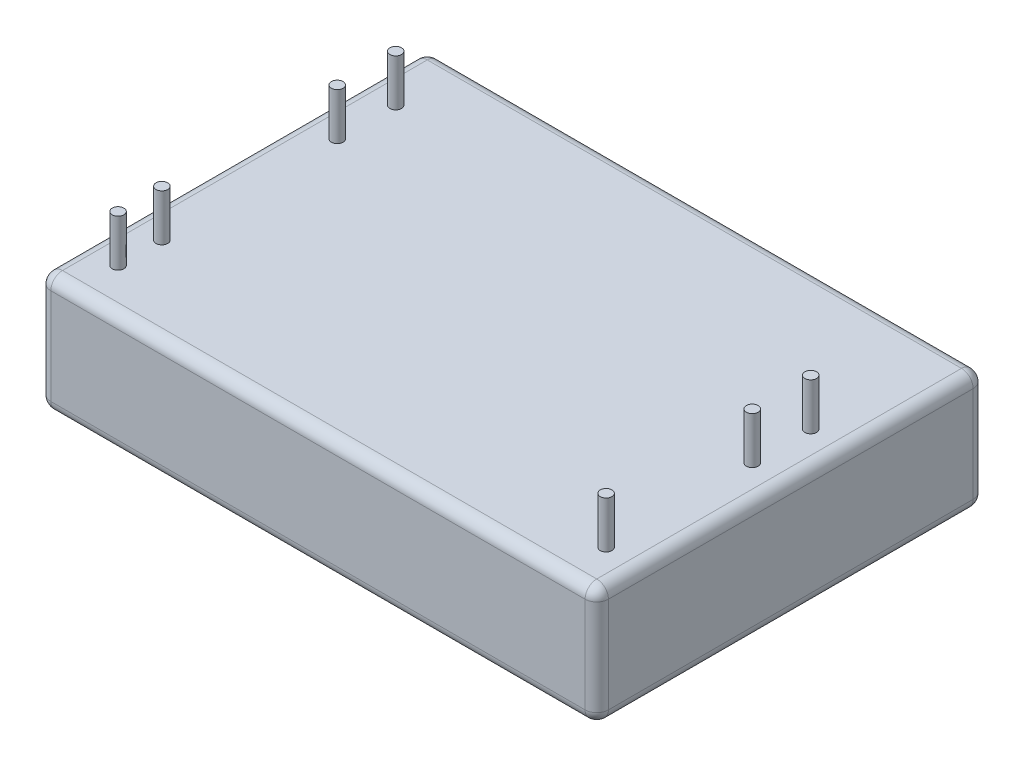
ISO-10303-21;
HEADER;
FILE_DESCRIPTION(('STEP AP214'),'2;1');
FILE_NAME('part.step','',(''),(''),'','','');
FILE_SCHEMA(('AUTOMOTIVE_DESIGN { 1 0 10303 214 1 1 1 1 }'));
ENDSEC;
DATA;
#1=APPLICATION_CONTEXT('core data for automotive mechanical design processes');
#2=APPLICATION_PROTOCOL_DEFINITION('international standard','automotive_design',2000,#1);
#3=PRODUCT_CONTEXT('',#1,'mechanical');
#4=PRODUCT('Part','Part','',(#3));
#5=PRODUCT_RELATED_PRODUCT_CATEGORY('part','',(#4));
#6=PRODUCT_DEFINITION_FORMATION('','',#4);
#7=PRODUCT_DEFINITION_CONTEXT('part definition',#1,'design');
#8=PRODUCT_DEFINITION('design','',#6,#7);
#9=PRODUCT_DEFINITION_SHAPE('','',#8);
#10=(LENGTH_UNIT() NAMED_UNIT(*) SI_UNIT(.MILLI.,.METRE.));
#11=(NAMED_UNIT(*) PLANE_ANGLE_UNIT() SI_UNIT($,.RADIAN.));
#12=(NAMED_UNIT(*) SI_UNIT($,.STERADIAN.) SOLID_ANGLE_UNIT());
#13=UNCERTAINTY_MEASURE_WITH_UNIT(LENGTH_MEASURE(1.E-05),#10,'distance_accuracy_value','');
#14=(GEOMETRIC_REPRESENTATION_CONTEXT(3) GLOBAL_UNCERTAINTY_ASSIGNED_CONTEXT((#13)) GLOBAL_UNIT_ASSIGNED_CONTEXT((#10,
#11,#12)) REPRESENTATION_CONTEXT('',''));
#15=CARTESIAN_POINT('',(0.,0.,0.));
#16=DIRECTION('',(0.,0.,1.));
#17=DIRECTION('',(1.,0.,0.));
#18=AXIS2_PLACEMENT_3D('',#15,#16,#17);
#19=CARTESIAN_POINT('',(23.85,10.2,-16.6));
#20=DIRECTION('',(-1.,0.,0.));
#21=DIRECTION('',(0.,0.,1.));
#22=AXIS2_PLACEMENT_3D('',#19,#20,#21);
#23=PLANE('',#22);
#24=DIRECTION('',(0.,0.,-1.));
#25=VECTOR('',#24,1.);
#26=CARTESIAN_POINT('',(23.85,0.999999999999999,-16.6));
#27=LINE('',#26,#25);
#28=CARTESIAN_POINT('',(23.85,0.999999999999999,15.6));
#29=VERTEX_POINT('',#28);
#30=CARTESIAN_POINT('',(23.85,0.999999999999999,-15.6));
#31=VERTEX_POINT('',#30);
#32=EDGE_CURVE('E293',#29,#31,#27,.T.);
#33=ORIENTED_EDGE('',*,*,#32,.T.);
#34=DIRECTION('',(0.,-1.,0.));
#35=VECTOR('',#34,1.);
#36=CARTESIAN_POINT('',(23.85,10.2,-15.6));
#37=LINE('',#36,#35);
#38=CARTESIAN_POINT('',(23.85,9.2,-15.6));
#39=VERTEX_POINT('',#38);
#40=EDGE_CURVE('E11',#31,#39,#37,.F.);
#41=ORIENTED_EDGE('',*,*,#40,.T.);
#42=DIRECTION('',(0.,0.,-1.));
#43=VECTOR('',#42,1.);
#44=CARTESIAN_POINT('',(23.85,9.2,15.6));
#45=LINE('',#44,#43);
#46=CARTESIAN_POINT('',(23.85,9.2,15.6));
#47=VERTEX_POINT('',#46);
#48=EDGE_CURVE('E141',#39,#47,#45,.F.);
#49=ORIENTED_EDGE('',*,*,#48,.T.);
#50=DIRECTION('',(0.,-1.,0.));
#51=VECTOR('',#50,1.);
#52=CARTESIAN_POINT('',(23.85,10.2,15.6));
#53=LINE('',#52,#51);
#54=EDGE_CURVE('E285',#47,#29,#53,.T.);
#55=ORIENTED_EDGE('',*,*,#54,.T.);
#56=EDGE_LOOP('',(#33,#41,#49,#55));
#57=FACE_BOUND('',#56,.T.);
#58=ADVANCED_FACE('F37',(#57),#23,.F.);
#59=CARTESIAN_POINT('',(-23.85,10.2,-16.6));
#60=DIRECTION('',(0.,0.,1.));
#61=DIRECTION('',(1.,0.,0.));
#62=AXIS2_PLACEMENT_3D('',#59,#60,#61);
#63=PLANE('',#62);
#64=DIRECTION('',(-1.,0.,0.));
#65=VECTOR('',#64,1.);
#66=CARTESIAN_POINT('',(23.85,9.2,-16.6));
#67=LINE('',#66,#65);
#68=CARTESIAN_POINT('',(-22.85,9.2,-16.6));
#69=VERTEX_POINT('',#68);
#70=CARTESIAN_POINT('',(22.85,9.2,-16.6));
#71=VERTEX_POINT('',#70);
#72=EDGE_CURVE('E166',#69,#71,#67,.F.);
#73=ORIENTED_EDGE('',*,*,#72,.T.);
#74=DIRECTION('',(0.,-1.,0.));
#75=VECTOR('',#74,1.);
#76=CARTESIAN_POINT('',(22.85,10.2,-16.6));
#77=LINE('',#76,#75);
#78=CARTESIAN_POINT('',(22.85,0.999999999999999,-16.6));
#79=VERTEX_POINT('',#78);
#80=EDGE_CURVE('E46',#71,#79,#77,.T.);
#81=ORIENTED_EDGE('',*,*,#80,.T.);
#82=DIRECTION('',(-1.,0.,0.));
#83=VECTOR('',#82,1.);
#84=CARTESIAN_POINT('',(-23.85,0.999999999999999,-16.6));
#85=LINE('',#84,#83);
#86=CARTESIAN_POINT('',(-22.85,0.999999999999999,-16.6));
#87=VERTEX_POINT('',#86);
#88=EDGE_CURVE('E228',#79,#87,#85,.T.);
#89=ORIENTED_EDGE('',*,*,#88,.T.);
#90=DIRECTION('',(0.,-1.,0.));
#91=VECTOR('',#90,1.);
#92=CARTESIAN_POINT('',(-22.85,10.2,-16.6));
#93=LINE('',#92,#91);
#94=EDGE_CURVE('E259',#87,#69,#93,.F.);
#95=ORIENTED_EDGE('',*,*,#94,.T.);
#96=EDGE_LOOP('',(#73,#81,#89,#95));
#97=FACE_BOUND('',#96,.T.);
#98=ADVANCED_FACE('F257',(#97),#63,.F.);
#99=CARTESIAN_POINT('',(-23.85,10.2,-16.6));
#100=DIRECTION('',(1.,0.,0.));
#101=DIRECTION('',(0.,0.,-1.));
#102=AXIS2_PLACEMENT_3D('',#99,#100,#101);
#103=PLANE('',#102);
#104=DIRECTION('',(0.,-1.,0.));
#105=VECTOR('',#104,1.);
#106=CARTESIAN_POINT('',(-23.85,10.2,15.6));
#107=LINE('',#106,#105);
#108=CARTESIAN_POINT('',(-23.85,0.999999999999999,15.6));
#109=VERTEX_POINT('',#108);
#110=CARTESIAN_POINT('',(-23.85,9.2,15.6));
#111=VERTEX_POINT('',#110);
#112=EDGE_CURVE('E173',#109,#111,#107,.F.);
#113=ORIENTED_EDGE('',*,*,#112,.T.);
#114=DIRECTION('',(0.,0.,1.));
#115=VECTOR('',#114,1.);
#116=CARTESIAN_POINT('',(-23.85,9.2,-15.6));
#117=LINE('',#116,#115);
#118=CARTESIAN_POINT('',(-23.85,9.2,-15.6));
#119=VERTEX_POINT('',#118);
#120=EDGE_CURVE('E175',#111,#119,#117,.F.);
#121=ORIENTED_EDGE('',*,*,#120,.T.);
#122=DIRECTION('',(0.,-1.,0.));
#123=VECTOR('',#122,1.);
#124=CARTESIAN_POINT('',(-23.85,10.2,-15.6));
#125=LINE('',#124,#123);
#126=CARTESIAN_POINT('',(-23.85,0.999999999999999,-15.6));
#127=VERTEX_POINT('',#126);
#128=EDGE_CURVE('E311',#119,#127,#125,.T.);
#129=ORIENTED_EDGE('',*,*,#128,.T.);
#130=DIRECTION('',(0.,0.,1.));
#131=VECTOR('',#130,1.);
#132=CARTESIAN_POINT('',(-23.85,0.999999999999999,-16.6));
#133=LINE('',#132,#131);
#134=EDGE_CURVE('E152',#127,#109,#133,.T.);
#135=ORIENTED_EDGE('',*,*,#134,.T.);
#136=EDGE_LOOP('',(#113,#121,#129,#135));
#137=FACE_BOUND('',#136,.T.);
#138=ADVANCED_FACE('F309',(#137),#103,.F.);
#139=CARTESIAN_POINT('',(-23.85,10.2,16.6));
#140=DIRECTION('',(0.,0.,-1.));
#141=DIRECTION('',(-1.,0.,0.));
#142=AXIS2_PLACEMENT_3D('',#139,#140,#141);
#143=PLANE('',#142);
#144=DIRECTION('',(1.,0.,0.));
#145=VECTOR('',#144,1.);
#146=CARTESIAN_POINT('',(-23.85,9.2,16.6));
#147=LINE('',#146,#145);
#148=CARTESIAN_POINT('',(22.85,9.2,16.6));
#149=VERTEX_POINT('',#148);
#150=CARTESIAN_POINT('',(-22.85,9.2,16.6));
#151=VERTEX_POINT('',#150);
#152=EDGE_CURVE('E177',#149,#151,#147,.F.);
#153=ORIENTED_EDGE('',*,*,#152,.T.);
#154=DIRECTION('',(0.,-1.,0.));
#155=VECTOR('',#154,1.);
#156=CARTESIAN_POINT('',(-22.85,10.2,16.6));
#157=LINE('',#156,#155);
#158=CARTESIAN_POINT('',(-22.85,0.999999999999999,16.6));
#159=VERTEX_POINT('',#158);
#160=EDGE_CURVE('E179',#151,#159,#157,.T.);
#161=ORIENTED_EDGE('',*,*,#160,.T.);
#162=DIRECTION('',(1.,0.,0.));
#163=VECTOR('',#162,1.);
#164=CARTESIAN_POINT('',(-23.85,0.999999999999999,16.6));
#165=LINE('',#164,#163);
#166=CARTESIAN_POINT('',(22.85,0.999999999999999,16.6));
#167=VERTEX_POINT('',#166);
#168=EDGE_CURVE('E136',#159,#167,#165,.T.);
#169=ORIENTED_EDGE('',*,*,#168,.T.);
#170=DIRECTION('',(0.,-1.,0.));
#171=VECTOR('',#170,1.);
#172=CARTESIAN_POINT('',(22.85,10.2,16.6));
#173=LINE('',#172,#171);
#174=EDGE_CURVE('E292',#167,#149,#173,.F.);
#175=ORIENTED_EDGE('',*,*,#174,.T.);
#176=EDGE_LOOP('',(#153,#161,#169,#175));
#177=FACE_BOUND('',#176,.T.);
#178=ADVANCED_FACE('F304',(#177),#143,.F.);
#179=CARTESIAN_POINT('',(0.,10.2,0.));
#180=DIRECTION('',(0.,1.,0.));
#181=DIRECTION('',(0.,0.,1.));
#182=AXIS2_PLACEMENT_3D('',#179,#180,#181);
#183=PLANE('',#182);
#184=DIRECTION('',(0.,0.,-1.));
#185=VECTOR('',#184,1.);
#186=CARTESIAN_POINT('',(22.85,10.2,-16.6));
#187=LINE('',#186,#185);
#188=CARTESIAN_POINT('',(22.85,10.2,15.6));
#189=VERTEX_POINT('',#188);
#190=CARTESIAN_POINT('',(22.85,10.2,-15.6));
#191=VERTEX_POINT('',#190);
#192=EDGE_CURVE('E250',#189,#191,#187,.T.);
#193=ORIENTED_EDGE('',*,*,#192,.T.);
#194=DIRECTION('',(-1.,0.,0.));
#195=VECTOR('',#194,1.);
#196=CARTESIAN_POINT('',(-22.85,10.2,-15.6));
#197=LINE('',#196,#195);
#198=CARTESIAN_POINT('',(-22.85,10.2,-15.6));
#199=VERTEX_POINT('',#198);
#200=EDGE_CURVE('E253',#191,#199,#197,.T.);
#201=ORIENTED_EDGE('',*,*,#200,.T.);
#202=DIRECTION('',(0.,0.,1.));
#203=VECTOR('',#202,1.);
#204=CARTESIAN_POINT('',(-22.85,10.2,16.6));
#205=LINE('',#204,#203);
#206=CARTESIAN_POINT('',(-22.85,10.2,15.6));
#207=VERTEX_POINT('',#206);
#208=EDGE_CURVE('E236',#199,#207,#205,.T.);
#209=ORIENTED_EDGE('',*,*,#208,.T.);
#210=DIRECTION('',(1.,0.,0.));
#211=VECTOR('',#210,1.);
#212=CARTESIAN_POINT('',(22.85,10.2,15.6));
#213=LINE('',#212,#211);
#214=EDGE_CURVE('E234',#207,#189,#213,.T.);
#215=ORIENTED_EDGE('',*,*,#214,.T.);
#216=EDGE_LOOP('',(#193,#201,#209,#215));
#217=FACE_BOUND('',#216,.T.);
#218=CARTESIAN_POINT('',(20.9,10.2,-4.65));
#219=DIRECTION('',(0.,1.,0.));
#220=DIRECTION('',(0.,0.,1.));
#221=AXIS2_PLACEMENT_3D('',#218,#219,#220);
#222=CIRCLE('',#221,0.499999999999999);
#223=CARTESIAN_POINT('',(20.9,10.2,-4.15000000000001));
#224=VERTEX_POINT('',#223);
#225=EDGE_CURVE('E247',#224,#224,#222,.T.);
#226=ORIENTED_EDGE('',*,*,#225,.F.);
#227=EDGE_LOOP('',(#226));
#228=FACE_BOUND('',#227,.T.);
#229=CARTESIAN_POINT('',(-20.85,10.2,9.1));
#230=DIRECTION('',(0.,1.,0.));
#231=DIRECTION('',(0.,0.,1.));
#232=AXIS2_PLACEMENT_3D('',#229,#230,#231);
#233=CIRCLE('',#232,0.499999999999999);
#234=CARTESIAN_POINT('',(-20.85,10.2,9.6));
#235=VERTEX_POINT('',#234);
#236=EDGE_CURVE('E727',#235,#235,#233,.T.);
#237=ORIENTED_EDGE('',*,*,#236,.F.);
#238=EDGE_LOOP('',(#237));
#239=FACE_BOUND('',#238,.T.);
#240=CARTESIAN_POINT('',(-20.85,10.2,12.85));
#241=DIRECTION('',(0.,1.,0.));
#242=DIRECTION('',(0.,0.,1.));
#243=AXIS2_PLACEMENT_3D('',#240,#241,#242);
#244=CIRCLE('',#243,0.499999999999999);
#245=CARTESIAN_POINT('',(-20.85,10.2,13.35));
#246=VERTEX_POINT('',#245);
#247=EDGE_CURVE('E721',#246,#246,#244,.T.);
#248=ORIENTED_EDGE('',*,*,#247,.F.);
#249=EDGE_LOOP('',(#248));
#250=FACE_BOUND('',#249,.T.);
#251=CARTESIAN_POINT('',(20.9,10.2,0.349999999999996));
#252=DIRECTION('',(0.,1.,0.));
#253=DIRECTION('',(0.,0.,1.));
#254=AXIS2_PLACEMENT_3D('',#251,#252,#253);
#255=CIRCLE('',#254,0.499999999999999);
#256=CARTESIAN_POINT('',(20.9,10.2,0.849999999999995));
#257=VERTEX_POINT('',#256);
#258=EDGE_CURVE('E715',#257,#257,#255,.T.);
#259=ORIENTED_EDGE('',*,*,#258,.F.);
#260=EDGE_LOOP('',(#259));
#261=FACE_BOUND('',#260,.T.);
#262=CARTESIAN_POINT('',(20.9,10.2,12.85));
#263=DIRECTION('',(0.,1.,0.));
#264=DIRECTION('',(0.,0.,1.));
#265=AXIS2_PLACEMENT_3D('',#262,#263,#264);
#266=CIRCLE('',#265,0.499999999999999);
#267=CARTESIAN_POINT('',(20.9,10.2,13.35));
#268=VERTEX_POINT('',#267);
#269=EDGE_CURVE('E709',#268,#268,#266,.T.);
#270=ORIENTED_EDGE('',*,*,#269,.F.);
#271=EDGE_LOOP('',(#270));
#272=FACE_BOUND('',#271,.T.);
#273=CARTESIAN_POINT('',(-20.85,10.2,-10.9));
#274=DIRECTION('',(0.,1.,0.));
#275=DIRECTION('',(0.,0.,1.));
#276=AXIS2_PLACEMENT_3D('',#273,#274,#275);
#277=CIRCLE('',#276,0.499999999999999);
#278=CARTESIAN_POINT('',(-20.85,10.2,-10.4));
#279=VERTEX_POINT('',#278);
#280=EDGE_CURVE('E702',#279,#279,#277,.T.);
#281=ORIENTED_EDGE('',*,*,#280,.F.);
#282=EDGE_LOOP('',(#281));
#283=FACE_BOUND('',#282,.T.);
#284=CARTESIAN_POINT('',(-20.85,10.2,-5.9));
#285=DIRECTION('',(0.,1.,0.));
#286=DIRECTION('',(0.,0.,1.));
#287=AXIS2_PLACEMENT_3D('',#284,#285,#286);
#288=CIRCLE('',#287,0.499999999999999);
#289=CARTESIAN_POINT('',(-20.85,10.2,-5.4));
#290=VERTEX_POINT('',#289);
#291=EDGE_CURVE('E316',#290,#290,#288,.T.);
#292=ORIENTED_EDGE('',*,*,#291,.F.);
#293=EDGE_LOOP('',(#292));
#294=FACE_BOUND('',#293,.T.);
#295=ADVANCED_FACE('F275',(#217,#228,#239,#250,#261,#272,#283,#294),#183,.T.);
#296=CARTESIAN_POINT('',(0.,0.,0.));
#297=DIRECTION('',(0.,1.,0.));
#298=DIRECTION('',(0.,0.,1.));
#299=AXIS2_PLACEMENT_3D('',#296,#297,#298);
#300=PLANE('',#299);
#301=DIRECTION('',(-1.,0.,0.));
#302=VECTOR('',#301,1.);
#303=CARTESIAN_POINT('',(0.,0.,-15.6));
#304=LINE('',#303,#302);
#305=CARTESIAN_POINT('',(-22.85,0.,-15.6));
#306=VERTEX_POINT('',#305);
#307=CARTESIAN_POINT('',(22.85,0.,-15.6));
#308=VERTEX_POINT('',#307);
#309=EDGE_CURVE('E227',#306,#308,#304,.F.);
#310=ORIENTED_EDGE('',*,*,#309,.T.);
#311=DIRECTION('',(0.,0.,-1.));
#312=VECTOR('',#311,1.);
#313=CARTESIAN_POINT('',(22.85,0.,0.));
#314=LINE('',#313,#312);
#315=CARTESIAN_POINT('',(22.85,0.,15.6));
#316=VERTEX_POINT('',#315);
#317=EDGE_CURVE('E151',#308,#316,#314,.F.);
#318=ORIENTED_EDGE('',*,*,#317,.T.);
#319=DIRECTION('',(1.,0.,0.));
#320=VECTOR('',#319,1.);
#321=CARTESIAN_POINT('',(0.,0.,15.6));
#322=LINE('',#321,#320);
#323=CARTESIAN_POINT('',(-22.85,0.,15.6));
#324=VERTEX_POINT('',#323);
#325=EDGE_CURVE('E134',#316,#324,#322,.F.);
#326=ORIENTED_EDGE('',*,*,#325,.T.);
#327=DIRECTION('',(0.,0.,1.));
#328=VECTOR('',#327,1.);
#329=CARTESIAN_POINT('',(-22.85,0.,0.));
#330=LINE('',#329,#328);
#331=EDGE_CURVE('E149',#324,#306,#330,.F.);
#332=ORIENTED_EDGE('',*,*,#331,.T.);
#333=EDGE_LOOP('',(#310,#318,#326,#332));
#334=FACE_BOUND('',#333,.T.);
#335=ADVANCED_FACE('F148',(#334),#300,.F.);
#336=CARTESIAN_POINT('',(-20.85,14.2,-5.9));
#337=DIRECTION('',(0.,-1.,0.));
#338=DIRECTION('',(0.,0.,-1.));
#339=AXIS2_PLACEMENT_3D('',#336,#337,#338);
#340=CYLINDRICAL_SURFACE('',#339,0.499999999999999);
#341=CARTESIAN_POINT('',(-20.85,14.2,-5.9));
#342=DIRECTION('',(0.,1.,0.));
#343=DIRECTION('',(0.,0.,1.));
#344=AXIS2_PLACEMENT_3D('',#341,#342,#343);
#345=CIRCLE('',#344,0.499999999999999);
#346=CARTESIAN_POINT('',(-20.85,14.2,-5.4));
#347=VERTEX_POINT('',#346);
#348=EDGE_CURVE('E313',#347,#347,#345,.T.);
#349=ORIENTED_EDGE('',*,*,#348,.F.);
#350=EDGE_LOOP('',(#349));
#351=FACE_BOUND('',#350,.T.);
#352=ORIENTED_EDGE('',*,*,#291,.T.);
#353=EDGE_LOOP('',(#352));
#354=FACE_BOUND('',#353,.T.);
#355=ADVANCED_FACE('F629',(#351,#354),#340,.T.);
#356=CARTESIAN_POINT('',(-20.85,14.2,-5.9));
#357=DIRECTION('',(0.,1.,0.));
#358=DIRECTION('',(0.,0.,1.));
#359=AXIS2_PLACEMENT_3D('',#356,#357,#358);
#360=PLANE('',#359);
#361=ORIENTED_EDGE('',*,*,#348,.T.);
#362=EDGE_LOOP('',(#361));
#363=FACE_BOUND('',#362,.T.);
#364=ADVANCED_FACE('F620',(#363),#360,.T.);
#365=CARTESIAN_POINT('',(-20.85,14.2,-10.9));
#366=DIRECTION('',(0.,-1.,0.));
#367=DIRECTION('',(0.,0.,-1.));
#368=AXIS2_PLACEMENT_3D('',#365,#366,#367);
#369=CYLINDRICAL_SURFACE('',#368,0.499999999999999);
#370=CARTESIAN_POINT('',(-20.85,14.2,-10.9));
#371=DIRECTION('',(0.,1.,0.));
#372=DIRECTION('',(0.,0.,1.));
#373=AXIS2_PLACEMENT_3D('',#370,#371,#372);
#374=CIRCLE('',#373,0.499999999999999);
#375=CARTESIAN_POINT('',(-20.85,14.2,-10.4));
#376=VERTEX_POINT('',#375);
#377=EDGE_CURVE('E700',#376,#376,#374,.T.);
#378=ORIENTED_EDGE('',*,*,#377,.F.);
#379=EDGE_LOOP('',(#378));
#380=FACE_BOUND('',#379,.T.);
#381=ORIENTED_EDGE('',*,*,#280,.T.);
#382=EDGE_LOOP('',(#381));
#383=FACE_BOUND('',#382,.T.);
#384=ADVANCED_FACE('F611',(#380,#383),#369,.T.);
#385=CARTESIAN_POINT('',(-20.85,14.2,-10.9));
#386=DIRECTION('',(0.,1.,0.));
#387=DIRECTION('',(0.,0.,1.));
#388=AXIS2_PLACEMENT_3D('',#385,#386,#387);
#389=PLANE('',#388);
#390=ORIENTED_EDGE('',*,*,#377,.T.);
#391=EDGE_LOOP('',(#390));
#392=FACE_BOUND('',#391,.T.);
#393=ADVANCED_FACE('F602',(#392),#389,.T.);
#394=CARTESIAN_POINT('',(20.9,14.2,12.85));
#395=DIRECTION('',(0.,-1.,0.));
#396=DIRECTION('',(0.,0.,-1.));
#397=AXIS2_PLACEMENT_3D('',#394,#395,#396);
#398=CYLINDRICAL_SURFACE('',#397,0.499999999999999);
#399=CARTESIAN_POINT('',(20.9,14.2,12.85));
#400=DIRECTION('',(0.,1.,0.));
#401=DIRECTION('',(0.,0.,1.));
#402=AXIS2_PLACEMENT_3D('',#399,#400,#401);
#403=CIRCLE('',#402,0.499999999999999);
#404=CARTESIAN_POINT('',(20.9,14.2,13.35));
#405=VERTEX_POINT('',#404);
#406=EDGE_CURVE('E706',#405,#405,#403,.T.);
#407=ORIENTED_EDGE('',*,*,#406,.F.);
#408=EDGE_LOOP('',(#407));
#409=FACE_BOUND('',#408,.T.);
#410=ORIENTED_EDGE('',*,*,#269,.T.);
#411=EDGE_LOOP('',(#410));
#412=FACE_BOUND('',#411,.T.);
#413=ADVANCED_FACE('F593',(#409,#412),#398,.T.);
#414=CARTESIAN_POINT('',(20.9,14.2,12.85));
#415=DIRECTION('',(0.,1.,0.));
#416=DIRECTION('',(0.,0.,1.));
#417=AXIS2_PLACEMENT_3D('',#414,#415,#416);
#418=PLANE('',#417);
#419=ORIENTED_EDGE('',*,*,#406,.T.);
#420=EDGE_LOOP('',(#419));
#421=FACE_BOUND('',#420,.T.);
#422=ADVANCED_FACE('F584',(#421),#418,.T.);
#423=CARTESIAN_POINT('',(20.9,14.2,0.349999999999996));
#424=DIRECTION('',(0.,-1.,0.));
#425=DIRECTION('',(0.,0.,-1.));
#426=AXIS2_PLACEMENT_3D('',#423,#424,#425);
#427=CYLINDRICAL_SURFACE('',#426,0.499999999999999);
#428=CARTESIAN_POINT('',(20.9,14.2,0.349999999999996));
#429=DIRECTION('',(0.,1.,0.));
#430=DIRECTION('',(0.,0.,1.));
#431=AXIS2_PLACEMENT_3D('',#428,#429,#430);
#432=CIRCLE('',#431,0.499999999999999);
#433=CARTESIAN_POINT('',(20.9,14.2,0.849999999999995));
#434=VERTEX_POINT('',#433);
#435=EDGE_CURVE('E712',#434,#434,#432,.T.);
#436=ORIENTED_EDGE('',*,*,#435,.F.);
#437=EDGE_LOOP('',(#436));
#438=FACE_BOUND('',#437,.T.);
#439=ORIENTED_EDGE('',*,*,#258,.T.);
#440=EDGE_LOOP('',(#439));
#441=FACE_BOUND('',#440,.T.);
#442=ADVANCED_FACE('F575',(#438,#441),#427,.T.);
#443=CARTESIAN_POINT('',(20.9,14.2,0.349999999999996));
#444=DIRECTION('',(0.,1.,0.));
#445=DIRECTION('',(0.,0.,1.));
#446=AXIS2_PLACEMENT_3D('',#443,#444,#445);
#447=PLANE('',#446);
#448=ORIENTED_EDGE('',*,*,#435,.T.);
#449=EDGE_LOOP('',(#448));
#450=FACE_BOUND('',#449,.T.);
#451=ADVANCED_FACE('F566',(#450),#447,.T.);
#452=CARTESIAN_POINT('',(-20.85,14.2,12.85));
#453=DIRECTION('',(0.,-1.,0.));
#454=DIRECTION('',(0.,0.,-1.));
#455=AXIS2_PLACEMENT_3D('',#452,#453,#454);
#456=CYLINDRICAL_SURFACE('',#455,0.499999999999999);
#457=CARTESIAN_POINT('',(-20.85,14.2,12.85));
#458=DIRECTION('',(0.,1.,0.));
#459=DIRECTION('',(0.,0.,1.));
#460=AXIS2_PLACEMENT_3D('',#457,#458,#459);
#461=CIRCLE('',#460,0.499999999999999);
#462=CARTESIAN_POINT('',(-20.85,14.2,13.35));
#463=VERTEX_POINT('',#462);
#464=EDGE_CURVE('E718',#463,#463,#461,.T.);
#465=ORIENTED_EDGE('',*,*,#464,.F.);
#466=EDGE_LOOP('',(#465));
#467=FACE_BOUND('',#466,.T.);
#468=ORIENTED_EDGE('',*,*,#247,.T.);
#469=EDGE_LOOP('',(#468));
#470=FACE_BOUND('',#469,.T.);
#471=ADVANCED_FACE('F557',(#467,#470),#456,.T.);
#472=CARTESIAN_POINT('',(-20.85,14.2,12.85));
#473=DIRECTION('',(0.,1.,0.));
#474=DIRECTION('',(0.,0.,1.));
#475=AXIS2_PLACEMENT_3D('',#472,#473,#474);
#476=PLANE('',#475);
#477=ORIENTED_EDGE('',*,*,#464,.T.);
#478=EDGE_LOOP('',(#477));
#479=FACE_BOUND('',#478,.T.);
#480=ADVANCED_FACE('F548',(#479),#476,.T.);
#481=CARTESIAN_POINT('',(-20.85,14.2,9.1));
#482=DIRECTION('',(0.,-1.,0.));
#483=DIRECTION('',(0.,0.,-1.));
#484=AXIS2_PLACEMENT_3D('',#481,#482,#483);
#485=CYLINDRICAL_SURFACE('',#484,0.499999999999999);
#486=CARTESIAN_POINT('',(-20.85,14.2,9.1));
#487=DIRECTION('',(0.,1.,0.));
#488=DIRECTION('',(0.,0.,1.));
#489=AXIS2_PLACEMENT_3D('',#486,#487,#488);
#490=CIRCLE('',#489,0.499999999999999);
#491=CARTESIAN_POINT('',(-20.85,14.2,9.6));
#492=VERTEX_POINT('',#491);
#493=EDGE_CURVE('E724',#492,#492,#490,.T.);
#494=ORIENTED_EDGE('',*,*,#493,.F.);
#495=EDGE_LOOP('',(#494));
#496=FACE_BOUND('',#495,.T.);
#497=ORIENTED_EDGE('',*,*,#236,.T.);
#498=EDGE_LOOP('',(#497));
#499=FACE_BOUND('',#498,.T.);
#500=ADVANCED_FACE('F539',(#496,#499),#485,.T.);
#501=CARTESIAN_POINT('',(-20.85,14.2,9.1));
#502=DIRECTION('',(0.,1.,0.));
#503=DIRECTION('',(0.,0.,1.));
#504=AXIS2_PLACEMENT_3D('',#501,#502,#503);
#505=PLANE('',#504);
#506=ORIENTED_EDGE('',*,*,#493,.T.);
#507=EDGE_LOOP('',(#506));
#508=FACE_BOUND('',#507,.T.);
#509=ADVANCED_FACE('F530',(#508),#505,.T.);
#510=CARTESIAN_POINT('',(20.9,14.2,-4.65));
#511=DIRECTION('',(0.,-1.,0.));
#512=DIRECTION('',(0.,0.,-1.));
#513=AXIS2_PLACEMENT_3D('',#510,#511,#512);
#514=CYLINDRICAL_SURFACE('',#513,0.499999999999999);
#515=CARTESIAN_POINT('',(20.9,14.2,-4.65));
#516=DIRECTION('',(0.,1.,0.));
#517=DIRECTION('',(0.,0.,1.));
#518=AXIS2_PLACEMENT_3D('',#515,#516,#517);
#519=CIRCLE('',#518,0.499999999999999);
#520=CARTESIAN_POINT('',(20.9,14.2,-4.15000000000001));
#521=VERTEX_POINT('',#520);
#522=EDGE_CURVE('E730',#521,#521,#519,.T.);
#523=ORIENTED_EDGE('',*,*,#522,.F.);
#524=EDGE_LOOP('',(#523));
#525=FACE_BOUND('',#524,.T.);
#526=ORIENTED_EDGE('',*,*,#225,.T.);
#527=EDGE_LOOP('',(#526));
#528=FACE_BOUND('',#527,.T.);
#529=ADVANCED_FACE('F521',(#525,#528),#514,.T.);
#530=CARTESIAN_POINT('',(20.9,14.2,-4.65));
#531=DIRECTION('',(0.,1.,0.));
#532=DIRECTION('',(0.,0.,1.));
#533=AXIS2_PLACEMENT_3D('',#530,#531,#532);
#534=PLANE('',#533);
#535=ORIENTED_EDGE('',*,*,#522,.T.);
#536=EDGE_LOOP('',(#535));
#537=FACE_BOUND('',#536,.T.);
#538=ADVANCED_FACE('F351',(#537),#534,.T.);
#539=CARTESIAN_POINT('',(-23.85,0.999999999999999,15.6));
#540=DIRECTION('',(1.,0.,0.));
#541=DIRECTION('',(0.,0.,-1.));
#542=AXIS2_PLACEMENT_3D('',#539,#540,#541);
#543=CYLINDRICAL_SURFACE('',#542,1.);
#544=ORIENTED_EDGE('',*,*,#168,.F.);
#545=CARTESIAN_POINT('',(-22.85,0.999999999999999,15.6));
#546=DIRECTION('',(1.,0.,0.));
#547=DIRECTION('',(0.,0.,-1.));
#548=AXIS2_PLACEMENT_3D('',#545,#546,#547);
#549=CIRCLE('',#548,1.);
#550=EDGE_CURVE('E130',#159,#324,#549,.T.);
#551=ORIENTED_EDGE('',*,*,#550,.T.);
#552=ORIENTED_EDGE('',*,*,#325,.F.);
#553=CARTESIAN_POINT('',(22.85,0.999999999999999,15.6));
#554=DIRECTION('',(1.,0.,0.));
#555=DIRECTION('',(0.,0.,-1.));
#556=AXIS2_PLACEMENT_3D('',#553,#554,#555);
#557=CIRCLE('',#556,1.);
#558=EDGE_CURVE('E323',#316,#167,#557,.F.);
#559=ORIENTED_EDGE('',*,*,#558,.T.);
#560=EDGE_LOOP('',(#544,#551,#552,#559));
#561=FACE_BOUND('',#560,.T.);
#562=ADVANCED_FACE('F132',(#561),#543,.T.);
#563=CARTESIAN_POINT('',(-22.85,0.999999999999999,-16.6));
#564=DIRECTION('',(0.,0.,1.));
#565=DIRECTION('',(1.,0.,0.));
#566=AXIS2_PLACEMENT_3D('',#563,#564,#565);
#567=CYLINDRICAL_SURFACE('',#566,1.);
#568=ORIENTED_EDGE('',*,*,#331,.F.);
#569=CARTESIAN_POINT('',(-22.85,0.999999999999999,15.6));
#570=DIRECTION('',(0.,0.,1.));
#571=DIRECTION('',(1.,0.,0.));
#572=AXIS2_PLACEMENT_3D('',#569,#570,#571);
#573=CIRCLE('',#572,1.);
#574=EDGE_CURVE('E142',#324,#109,#573,.F.);
#575=ORIENTED_EDGE('',*,*,#574,.T.);
#576=ORIENTED_EDGE('',*,*,#134,.F.);
#577=CARTESIAN_POINT('',(-22.85,0.999999999999999,-15.6));
#578=DIRECTION('',(0.,0.,1.));
#579=DIRECTION('',(1.,0.,0.));
#580=AXIS2_PLACEMENT_3D('',#577,#578,#579);
#581=CIRCLE('',#580,1.);
#582=EDGE_CURVE('E159',#127,#306,#581,.T.);
#583=ORIENTED_EDGE('',*,*,#582,.T.);
#584=EDGE_LOOP('',(#568,#575,#576,#583));
#585=FACE_BOUND('',#584,.T.);
#586=ADVANCED_FACE('F155',(#585),#567,.T.);
#587=CARTESIAN_POINT('',(-22.85,10.2,-15.6));
#588=DIRECTION('',(0.,-1.,0.));
#589=DIRECTION('',(0.,0.,-1.));
#590=AXIS2_PLACEMENT_3D('',#587,#588,#589);
#591=CYLINDRICAL_SURFACE('',#590,1.);
#592=ORIENTED_EDGE('',*,*,#128,.F.);
#593=CARTESIAN_POINT('',(-22.85,9.2,-15.6));
#594=DIRECTION('',(0.,-1.,0.));
#595=DIRECTION('',(0.,0.,-1.));
#596=AXIS2_PLACEMENT_3D('',#593,#594,#595);
#597=CIRCLE('',#596,1.);
#598=EDGE_CURVE('E164',#119,#69,#597,.T.);
#599=ORIENTED_EDGE('',*,*,#598,.T.);
#600=ORIENTED_EDGE('',*,*,#94,.F.);
#601=CARTESIAN_POINT('',(-22.85,0.999999999999999,-15.6));
#602=DIRECTION('',(0.,-1.,0.));
#603=DIRECTION('',(0.,0.,-1.));
#604=AXIS2_PLACEMENT_3D('',#601,#602,#603);
#605=CIRCLE('',#604,1.);
#606=EDGE_CURVE('E245',#127,#87,#605,.T.);
#607=ORIENTED_EDGE('',*,*,#606,.F.);
#608=EDGE_LOOP('',(#592,#599,#600,#607));
#609=FACE_BOUND('',#608,.T.);
#610=ADVANCED_FACE('F328',(#609),#591,.T.);
#611=CARTESIAN_POINT('',(-22.85,0.999999999999999,-15.6));
#612=DIRECTION('',(0.,0.,1.));
#613=DIRECTION('',(1.,0.,0.));
#614=AXIS2_PLACEMENT_3D('',#611,#612,#613);
#615=SPHERICAL_SURFACE('',#614,1.);
#616=ORIENTED_EDGE('',*,*,#582,.F.);
#617=ORIENTED_EDGE('',*,*,#606,.T.);
#618=CARTESIAN_POINT('',(-22.85,0.999999999999999,-15.6));
#619=DIRECTION('',(1.,0.,0.));
#620=DIRECTION('',(0.,0.,-1.));
#621=AXIS2_PLACEMENT_3D('',#618,#619,#620);
#622=CIRCLE('',#621,1.);
#623=EDGE_CURVE('E243',#306,#87,#622,.T.);
#624=ORIENTED_EDGE('',*,*,#623,.F.);
#625=EDGE_LOOP('',(#616,#617,#624));
#626=FACE_BOUND('',#625,.T.);
#627=ADVANCED_FACE('F330',(#626),#615,.T.);
#628=CARTESIAN_POINT('',(-23.85,0.999999999999999,-15.6));
#629=DIRECTION('',(-1.,0.,0.));
#630=DIRECTION('',(0.,0.,1.));
#631=AXIS2_PLACEMENT_3D('',#628,#629,#630);
#632=CYLINDRICAL_SURFACE('',#631,1.);
#633=ORIENTED_EDGE('',*,*,#88,.F.);
#634=CARTESIAN_POINT('',(22.85,0.999999999999999,-15.6));
#635=DIRECTION('',(-1.,0.,0.));
#636=DIRECTION('',(0.,0.,1.));
#637=AXIS2_PLACEMENT_3D('',#634,#635,#636);
#638=CIRCLE('',#637,1.);
#639=EDGE_CURVE('E209',#79,#308,#638,.T.);
#640=ORIENTED_EDGE('',*,*,#639,.T.);
#641=ORIENTED_EDGE('',*,*,#309,.F.);
#642=ORIENTED_EDGE('',*,*,#623,.T.);
#643=EDGE_LOOP('',(#633,#640,#641,#642));
#644=FACE_BOUND('',#643,.T.);
#645=ADVANCED_FACE('F225',(#644),#632,.T.);
#646=CARTESIAN_POINT('',(22.85,0.999999999999999,-16.6));
#647=DIRECTION('',(0.,0.,-1.));
#648=DIRECTION('',(-1.,0.,0.));
#649=AXIS2_PLACEMENT_3D('',#646,#647,#648);
#650=CYLINDRICAL_SURFACE('',#649,1.);
#651=ORIENTED_EDGE('',*,*,#317,.F.);
#652=CARTESIAN_POINT('',(22.85,0.999999999999999,-15.6));
#653=DIRECTION('',(0.,0.,-1.));
#654=DIRECTION('',(-1.,0.,0.));
#655=AXIS2_PLACEMENT_3D('',#652,#653,#654);
#656=CIRCLE('',#655,1.);
#657=EDGE_CURVE('E61',#308,#31,#656,.F.);
#658=ORIENTED_EDGE('',*,*,#657,.T.);
#659=ORIENTED_EDGE('',*,*,#32,.F.);
#660=CARTESIAN_POINT('',(22.85,1.,15.6));
#661=DIRECTION('',(0.,0.,1.));
#662=DIRECTION('',(1.,0.,0.));
#663=AXIS2_PLACEMENT_3D('',#660,#661,#662);
#664=CIRCLE('',#663,1.);
#665=EDGE_CURVE('E232',#316,#29,#664,.T.);
#666=ORIENTED_EDGE('',*,*,#665,.F.);
#667=EDGE_LOOP('',(#651,#658,#659,#666));
#668=FACE_BOUND('',#667,.T.);
#669=ADVANCED_FACE('F230',(#668),#650,.T.);
#670=CARTESIAN_POINT('',(22.85,0.999999999999999,15.6));
#671=DIRECTION('',(-1.,0.,0.));
#672=DIRECTION('',(0.,0.,1.));
#673=AXIS2_PLACEMENT_3D('',#670,#671,#672);
#674=SPHERICAL_SURFACE('',#673,1.);
#675=ORIENTED_EDGE('',*,*,#558,.F.);
#676=ORIENTED_EDGE('',*,*,#665,.T.);
#677=CARTESIAN_POINT('',(22.85,0.999999999999999,15.6));
#678=DIRECTION('',(0.,1.,0.));
#679=DIRECTION('',(0.,0.,1.));
#680=AXIS2_PLACEMENT_3D('',#677,#678,#679);
#681=CIRCLE('',#680,1.);
#682=EDGE_CURVE('E203',#167,#29,#681,.T.);
#683=ORIENTED_EDGE('',*,*,#682,.F.);
#684=EDGE_LOOP('',(#675,#676,#683));
#685=FACE_BOUND('',#684,.T.);
#686=ADVANCED_FACE('F354',(#685),#674,.T.);
#687=CARTESIAN_POINT('',(22.85,10.2,15.6));
#688=DIRECTION('',(0.,-1.,0.));
#689=DIRECTION('',(0.,0.,-1.));
#690=AXIS2_PLACEMENT_3D('',#687,#688,#689);
#691=CYLINDRICAL_SURFACE('',#690,1.);
#692=ORIENTED_EDGE('',*,*,#54,.F.);
#693=CARTESIAN_POINT('',(22.85,9.2,15.6));
#694=DIRECTION('',(0.,-1.,0.));
#695=DIRECTION('',(0.,0.,-1.));
#696=AXIS2_PLACEMENT_3D('',#693,#694,#695);
#697=CIRCLE('',#696,1.);
#698=EDGE_CURVE('E171',#47,#149,#697,.T.);
#699=ORIENTED_EDGE('',*,*,#698,.T.);
#700=ORIENTED_EDGE('',*,*,#174,.F.);
#701=ORIENTED_EDGE('',*,*,#682,.T.);
#702=EDGE_LOOP('',(#692,#699,#700,#701));
#703=FACE_BOUND('',#702,.T.);
#704=ADVANCED_FACE('F288',(#703),#691,.T.);
#705=CARTESIAN_POINT('',(-22.85,0.999999999999999,15.6));
#706=DIRECTION('',(0.,0.,1.));
#707=DIRECTION('',(1.,0.,0.));
#708=AXIS2_PLACEMENT_3D('',#705,#706,#707);
#709=SPHERICAL_SURFACE('',#708,1.);
#710=ORIENTED_EDGE('',*,*,#574,.F.);
#711=ORIENTED_EDGE('',*,*,#550,.F.);
#712=CARTESIAN_POINT('',(-22.85,0.999999999999999,15.6));
#713=DIRECTION('',(0.,1.,0.));
#714=DIRECTION('',(0.,0.,1.));
#715=AXIS2_PLACEMENT_3D('',#712,#713,#714);
#716=CIRCLE('',#715,1.);
#717=EDGE_CURVE('E162',#109,#159,#716,.T.);
#718=ORIENTED_EDGE('',*,*,#717,.F.);
#719=EDGE_LOOP('',(#710,#711,#718));
#720=FACE_BOUND('',#719,.T.);
#721=ADVANCED_FACE('F161',(#720),#709,.T.);
#722=CARTESIAN_POINT('',(-22.85,10.2,15.6));
#723=DIRECTION('',(0.,-1.,0.));
#724=DIRECTION('',(0.,0.,-1.));
#725=AXIS2_PLACEMENT_3D('',#722,#723,#724);
#726=CYLINDRICAL_SURFACE('',#725,1.);
#727=ORIENTED_EDGE('',*,*,#717,.T.);
#728=ORIENTED_EDGE('',*,*,#160,.F.);
#729=CARTESIAN_POINT('',(-22.85,9.2,15.6));
#730=DIRECTION('',(0.,1.,0.));
#731=DIRECTION('',(0.,0.,1.));
#732=AXIS2_PLACEMENT_3D('',#729,#730,#731);
#733=CIRCLE('',#732,1.);
#734=EDGE_CURVE('E196',#111,#151,#733,.T.);
#735=ORIENTED_EDGE('',*,*,#734,.F.);
#736=ORIENTED_EDGE('',*,*,#112,.F.);
#737=EDGE_LOOP('',(#727,#728,#735,#736));
#738=FACE_BOUND('',#737,.T.);
#739=ADVANCED_FACE('F307',(#738),#726,.T.);
#740=CARTESIAN_POINT('',(0.,9.2,15.6));
#741=DIRECTION('',(-1.,0.,0.));
#742=DIRECTION('',(0.,0.,1.));
#743=AXIS2_PLACEMENT_3D('',#740,#741,#742);
#744=CYLINDRICAL_SURFACE('',#743,1.);
#745=CARTESIAN_POINT('',(-22.85,9.2,15.6));
#746=DIRECTION('',(-1.,0.,0.));
#747=DIRECTION('',(0.,0.,1.));
#748=AXIS2_PLACEMENT_3D('',#745,#746,#747);
#749=CIRCLE('',#748,1.);
#750=EDGE_CURVE('E199',#151,#207,#749,.T.);
#751=ORIENTED_EDGE('',*,*,#750,.F.);
#752=ORIENTED_EDGE('',*,*,#152,.F.);
#753=CARTESIAN_POINT('',(22.85,9.2,15.6));
#754=DIRECTION('',(1.,0.,0.));
#755=DIRECTION('',(0.,0.,-1.));
#756=AXIS2_PLACEMENT_3D('',#753,#754,#755);
#757=CIRCLE('',#756,1.);
#758=EDGE_CURVE('E193',#189,#149,#757,.T.);
#759=ORIENTED_EDGE('',*,*,#758,.F.);
#760=ORIENTED_EDGE('',*,*,#214,.F.);
#761=EDGE_LOOP('',(#751,#752,#759,#760));
#762=FACE_BOUND('',#761,.T.);
#763=ADVANCED_FACE('F301',(#762),#744,.T.);
#764=CARTESIAN_POINT('',(-22.85,9.2,15.6));
#765=DIRECTION('',(0.,0.,1.));
#766=DIRECTION('',(1.,0.,0.));
#767=AXIS2_PLACEMENT_3D('',#764,#765,#766);
#768=SPHERICAL_SURFACE('',#767,1.);
#769=ORIENTED_EDGE('',*,*,#734,.T.);
#770=ORIENTED_EDGE('',*,*,#750,.T.);
#771=CARTESIAN_POINT('',(-22.85,9.2,15.6));
#772=DIRECTION('',(0.,0.,1.));
#773=DIRECTION('',(1.,0.,0.));
#774=AXIS2_PLACEMENT_3D('',#771,#772,#773);
#775=CIRCLE('',#774,1.);
#776=EDGE_CURVE('E190',#111,#207,#775,.F.);
#777=ORIENTED_EDGE('',*,*,#776,.F.);
#778=EDGE_LOOP('',(#769,#770,#777));
#779=FACE_BOUND('',#778,.T.);
#780=ADVANCED_FACE('F392',(#779),#768,.T.);
#781=CARTESIAN_POINT('',(22.85,9.2,15.6));
#782=DIRECTION('',(0.,1.,0.));
#783=DIRECTION('',(0.,0.,1.));
#784=AXIS2_PLACEMENT_3D('',#781,#782,#783);
#785=SPHERICAL_SURFACE('',#784,1.);
#786=ORIENTED_EDGE('',*,*,#758,.T.);
#787=ORIENTED_EDGE('',*,*,#698,.F.);
#788=CARTESIAN_POINT('',(22.85,9.2,15.6));
#789=DIRECTION('',(0.,0.,-1.));
#790=DIRECTION('',(-1.,0.,0.));
#791=AXIS2_PLACEMENT_3D('',#788,#789,#790);
#792=CIRCLE('',#791,1.);
#793=EDGE_CURVE('E187',#189,#47,#792,.T.);
#794=ORIENTED_EDGE('',*,*,#793,.F.);
#795=EDGE_LOOP('',(#786,#787,#794));
#796=FACE_BOUND('',#795,.T.);
#797=ADVANCED_FACE('F296',(#796),#785,.T.);
#798=CARTESIAN_POINT('',(-22.85,9.2,0.));
#799=DIRECTION('',(0.,0.,-1.));
#800=DIRECTION('',(-1.,0.,0.));
#801=AXIS2_PLACEMENT_3D('',#798,#799,#800);
#802=CYLINDRICAL_SURFACE('',#801,1.);
#803=ORIENTED_EDGE('',*,*,#776,.T.);
#804=ORIENTED_EDGE('',*,*,#208,.F.);
#805=CARTESIAN_POINT('',(-22.85,9.2,-15.6));
#806=DIRECTION('',(0.,0.,-1.));
#807=DIRECTION('',(-1.,0.,0.));
#808=AXIS2_PLACEMENT_3D('',#805,#806,#807);
#809=CIRCLE('',#808,1.);
#810=EDGE_CURVE('E184',#119,#199,#809,.T.);
#811=ORIENTED_EDGE('',*,*,#810,.F.);
#812=ORIENTED_EDGE('',*,*,#120,.F.);
#813=EDGE_LOOP('',(#803,#804,#811,#812));
#814=FACE_BOUND('',#813,.T.);
#815=ADVANCED_FACE('F271',(#814),#802,.T.);
#816=CARTESIAN_POINT('',(22.85,9.2,0.));
#817=DIRECTION('',(0.,0.,1.));
#818=DIRECTION('',(1.,0.,0.));
#819=AXIS2_PLACEMENT_3D('',#816,#817,#818);
#820=CYLINDRICAL_SURFACE('',#819,1.);
#821=ORIENTED_EDGE('',*,*,#48,.F.);
#822=CARTESIAN_POINT('',(22.85,9.2,-15.6));
#823=DIRECTION('',(0.,0.,1.));
#824=DIRECTION('',(1.,0.,0.));
#825=AXIS2_PLACEMENT_3D('',#822,#823,#824);
#826=CIRCLE('',#825,1.);
#827=EDGE_CURVE('E206',#39,#191,#826,.T.);
#828=ORIENTED_EDGE('',*,*,#827,.T.);
#829=ORIENTED_EDGE('',*,*,#192,.F.);
#830=ORIENTED_EDGE('',*,*,#793,.T.);
#831=EDGE_LOOP('',(#821,#828,#829,#830));
#832=FACE_BOUND('',#831,.T.);
#833=ADVANCED_FACE('F281',(#832),#820,.T.);
#834=CARTESIAN_POINT('',(-22.85,9.2,-15.6));
#835=DIRECTION('',(0.,1.,0.));
#836=DIRECTION('',(0.,0.,1.));
#837=AXIS2_PLACEMENT_3D('',#834,#835,#836);
#838=SPHERICAL_SURFACE('',#837,1.);
#839=ORIENTED_EDGE('',*,*,#598,.F.);
#840=ORIENTED_EDGE('',*,*,#810,.T.);
#841=CARTESIAN_POINT('',(-22.85,9.2,-15.6));
#842=DIRECTION('',(1.,0.,0.));
#843=DIRECTION('',(0.,0.,-1.));
#844=AXIS2_PLACEMENT_3D('',#841,#842,#843);
#845=CIRCLE('',#844,1.);
#846=EDGE_CURVE('E182',#69,#199,#845,.T.);
#847=ORIENTED_EDGE('',*,*,#846,.F.);
#848=EDGE_LOOP('',(#839,#840,#847));
#849=FACE_BOUND('',#848,.T.);
#850=ADVANCED_FACE('F266',(#849),#838,.T.);
#851=CARTESIAN_POINT('',(0.,9.2,-15.6));
#852=DIRECTION('',(1.,0.,0.));
#853=DIRECTION('',(0.,0.,-1.));
#854=AXIS2_PLACEMENT_3D('',#851,#852,#853);
#855=CYLINDRICAL_SURFACE('',#854,1.);
#856=ORIENTED_EDGE('',*,*,#200,.F.);
#857=CARTESIAN_POINT('',(22.85,9.2,-15.6));
#858=DIRECTION('',(1.,0.,0.));
#859=DIRECTION('',(0.,0.,-1.));
#860=AXIS2_PLACEMENT_3D('',#857,#858,#859);
#861=CIRCLE('',#860,1.);
#862=EDGE_CURVE('E181',#191,#71,#861,.F.);
#863=ORIENTED_EDGE('',*,*,#862,.T.);
#864=ORIENTED_EDGE('',*,*,#72,.F.);
#865=ORIENTED_EDGE('',*,*,#846,.T.);
#866=EDGE_LOOP('',(#856,#863,#864,#865));
#867=FACE_BOUND('',#866,.T.);
#868=ADVANCED_FACE('F263',(#867),#855,.T.);
#869=CARTESIAN_POINT('',(22.85,0.999999999999999,-15.6));
#870=DIRECTION('',(0.,0.,1.));
#871=DIRECTION('',(1.,0.,0.));
#872=AXIS2_PLACEMENT_3D('',#869,#870,#871);
#873=SPHERICAL_SURFACE('',#872,1.);
#874=ORIENTED_EDGE('',*,*,#657,.F.);
#875=ORIENTED_EDGE('',*,*,#639,.F.);
#876=CARTESIAN_POINT('',(22.85,0.999999999999999,-15.6));
#877=DIRECTION('',(0.,1.,0.));
#878=DIRECTION('',(0.,0.,1.));
#879=AXIS2_PLACEMENT_3D('',#876,#877,#878);
#880=CIRCLE('',#879,1.);
#881=EDGE_CURVE('E41',#31,#79,#880,.T.);
#882=ORIENTED_EDGE('',*,*,#881,.F.);
#883=EDGE_LOOP('',(#874,#875,#882));
#884=FACE_BOUND('',#883,.T.);
#885=ADVANCED_FACE('F39',(#884),#873,.T.);
#886=CARTESIAN_POINT('',(22.85,10.2,-15.6));
#887=DIRECTION('',(0.,-1.,0.));
#888=DIRECTION('',(0.,0.,-1.));
#889=AXIS2_PLACEMENT_3D('',#886,#887,#888);
#890=CYLINDRICAL_SURFACE('',#889,1.);
#891=ORIENTED_EDGE('',*,*,#881,.T.);
#892=ORIENTED_EDGE('',*,*,#80,.F.);
#893=CARTESIAN_POINT('',(22.85,9.2,-15.6));
#894=DIRECTION('',(0.,1.,0.));
#895=DIRECTION('',(0.,0.,1.));
#896=AXIS2_PLACEMENT_3D('',#893,#894,#895);
#897=CIRCLE('',#896,1.);
#898=EDGE_CURVE('E211',#39,#71,#897,.T.);
#899=ORIENTED_EDGE('',*,*,#898,.F.);
#900=ORIENTED_EDGE('',*,*,#40,.F.);
#901=EDGE_LOOP('',(#891,#892,#899,#900));
#902=FACE_BOUND('',#901,.T.);
#903=ADVANCED_FACE('F220',(#902),#890,.T.);
#904=CARTESIAN_POINT('',(22.85,9.2,-15.6));
#905=DIRECTION('',(0.,0.,1.));
#906=DIRECTION('',(1.,0.,0.));
#907=AXIS2_PLACEMENT_3D('',#904,#905,#906);
#908=SPHERICAL_SURFACE('',#907,1.);
#909=ORIENTED_EDGE('',*,*,#862,.F.);
#910=ORIENTED_EDGE('',*,*,#827,.F.);
#911=ORIENTED_EDGE('',*,*,#898,.T.);
#912=EDGE_LOOP('',(#909,#910,#911));
#913=FACE_BOUND('',#912,.T.);
#914=ADVANCED_FACE('F278',(#913),#908,.T.);
#915=CLOSED_SHELL('',(#58,#98,#138,#178,#295,#335,#355,#364,#384,#393,#413,#422,#442,#451,#471,
#480,#500,#509,#529,#538,#562,#586,#610,#627,#645,#669,#686,#704,#721,#739,#763,#780,#797,#815,
#833,#850,#868,#885,#903,#914));
#916=MANIFOLD_SOLID_BREP('B2',#915);
#917=ADVANCED_BREP_SHAPE_REPRESENTATION('',(#18,#916),#14);
#918=SHAPE_DEFINITION_REPRESENTATION(#9,#917);
ENDSEC;
END-ISO-10303-21;
